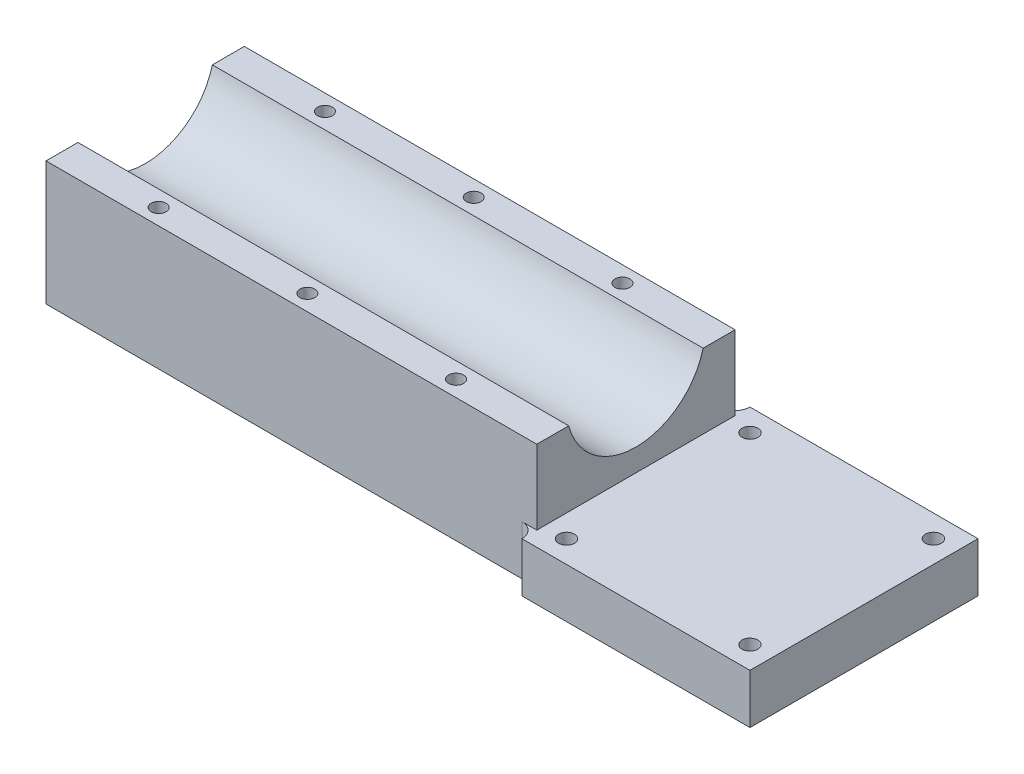
ISO-10303-21;
HEADER;
FILE_DESCRIPTION(('STEP AP214'),'2;1');
FILE_NAME('part.step','',(''),(''),'','','');
FILE_SCHEMA(('AUTOMOTIVE_DESIGN { 1 0 10303 214 1 1 1 1 }'));
ENDSEC;
DATA;
#1=APPLICATION_CONTEXT('core data for automotive mechanical design processes');
#2=APPLICATION_PROTOCOL_DEFINITION('international standard','automotive_design',2000,#1);
#3=PRODUCT_CONTEXT('',#1,'mechanical');
#4=PRODUCT('Part','Part','',(#3));
#5=PRODUCT_RELATED_PRODUCT_CATEGORY('part','',(#4));
#6=PRODUCT_DEFINITION_FORMATION('','',#4);
#7=PRODUCT_DEFINITION_CONTEXT('part definition',#1,'design');
#8=PRODUCT_DEFINITION('design','',#6,#7);
#9=PRODUCT_DEFINITION_SHAPE('','',#8);
#10=(LENGTH_UNIT() NAMED_UNIT(*) SI_UNIT(.MILLI.,.METRE.));
#11=(NAMED_UNIT(*) PLANE_ANGLE_UNIT() SI_UNIT($,.RADIAN.));
#12=(NAMED_UNIT(*) SI_UNIT($,.STERADIAN.) SOLID_ANGLE_UNIT());
#13=UNCERTAINTY_MEASURE_WITH_UNIT(LENGTH_MEASURE(1.E-05),#10,'distance_accuracy_value','');
#14=(GEOMETRIC_REPRESENTATION_CONTEXT(3) GLOBAL_UNCERTAINTY_ASSIGNED_CONTEXT((#13)) GLOBAL_UNIT_ASSIGNED_CONTEXT((#10,
#11,#12)) REPRESENTATION_CONTEXT('',''));
#15=CARTESIAN_POINT('',(0.,0.,0.));
#16=DIRECTION('',(0.,0.,1.));
#17=DIRECTION('',(1.,0.,0.));
#18=AXIS2_PLACEMENT_3D('',#15,#16,#17);
#19=CARTESIAN_POINT('',(103.5,-15.,-1.50000000000001));
#20=DIRECTION('',(0.,-1.,0.));
#21=DIRECTION('',(0.,0.,-1.));
#22=AXIS2_PLACEMENT_3D('',#19,#20,#21);
#23=CYLINDRICAL_SURFACE('',#22,1.60000000000001);
#24=CARTESIAN_POINT('',(103.5,-15.,-1.50000000000001));
#25=DIRECTION('',(0.,-1.,0.));
#26=DIRECTION('',(0.,0.,-1.));
#27=AXIS2_PLACEMENT_3D('',#24,#25,#26);
#28=CIRCLE('',#27,1.60000000000001);
#29=CARTESIAN_POINT('',(103.5,-15.,-3.10000000000002));
#30=VERTEX_POINT('',#29);
#31=EDGE_CURVE('E160',#30,#30,#28,.T.);
#32=ORIENTED_EDGE('',*,*,#31,.F.);
#33=EDGE_LOOP('',(#32));
#34=FACE_BOUND('',#33,.T.);
#35=CARTESIAN_POINT('',(103.5,-21.,-1.50000000000001));
#36=DIRECTION('',(0.,-1.,0.));
#37=DIRECTION('',(0.,0.,-1.));
#38=AXIS2_PLACEMENT_3D('',#35,#36,#37);
#39=CIRCLE('',#38,1.60000000000001);
#40=CARTESIAN_POINT('',(103.5,-21.,-3.10000000000002));
#41=VERTEX_POINT('',#40);
#42=EDGE_CURVE('E221',#41,#41,#39,.F.);
#43=ORIENTED_EDGE('',*,*,#42,.F.);
#44=EDGE_LOOP('',(#43));
#45=FACE_BOUND('',#44,.T.);
#46=ADVANCED_FACE('F35',(#34,#45),#23,.F.);
#47=CARTESIAN_POINT('',(140.5,-15.,-38.5));
#48=DIRECTION('',(0.,-1.,0.));
#49=DIRECTION('',(0.,0.,-1.));
#50=AXIS2_PLACEMENT_3D('',#47,#48,#49);
#51=CYLINDRICAL_SURFACE('',#50,1.60000000000002);
#52=CARTESIAN_POINT('',(140.5,-15.,-38.5));
#53=DIRECTION('',(0.,-1.,0.));
#54=DIRECTION('',(0.,0.,-1.));
#55=AXIS2_PLACEMENT_3D('',#52,#53,#54);
#56=CIRCLE('',#55,1.60000000000002);
#57=CARTESIAN_POINT('',(140.5,-15.,-40.1));
#58=VERTEX_POINT('',#57);
#59=EDGE_CURVE('E224',#58,#58,#56,.T.);
#60=ORIENTED_EDGE('',*,*,#59,.F.);
#61=EDGE_LOOP('',(#60));
#62=FACE_BOUND('',#61,.T.);
#63=CARTESIAN_POINT('',(140.5,-21.,-38.5));
#64=DIRECTION('',(0.,-1.,0.));
#65=DIRECTION('',(0.,0.,-1.));
#66=AXIS2_PLACEMENT_3D('',#63,#64,#65);
#67=CIRCLE('',#66,1.60000000000002);
#68=CARTESIAN_POINT('',(140.5,-21.,-40.1));
#69=VERTEX_POINT('',#68);
#70=EDGE_CURVE('E218',#69,#69,#67,.F.);
#71=ORIENTED_EDGE('',*,*,#70,.F.);
#72=EDGE_LOOP('',(#71));
#73=FACE_BOUND('',#72,.T.);
#74=ADVANCED_FACE('F280',(#62,#73),#51,.F.);
#75=CARTESIAN_POINT('',(103.5,-15.,-38.5));
#76=DIRECTION('',(0.,-1.,0.));
#77=DIRECTION('',(0.,0.,-1.));
#78=AXIS2_PLACEMENT_3D('',#75,#76,#77);
#79=CYLINDRICAL_SURFACE('',#78,1.60000000000001);
#80=CARTESIAN_POINT('',(103.5,-15.,-38.5));
#81=DIRECTION('',(0.,-1.,0.));
#82=DIRECTION('',(0.,0.,-1.));
#83=AXIS2_PLACEMENT_3D('',#80,#81,#82);
#84=CIRCLE('',#83,1.60000000000001);
#85=CARTESIAN_POINT('',(103.5,-15.,-40.1));
#86=VERTEX_POINT('',#85);
#87=EDGE_CURVE('E672',#86,#86,#84,.T.);
#88=ORIENTED_EDGE('',*,*,#87,.F.);
#89=EDGE_LOOP('',(#88));
#90=FACE_BOUND('',#89,.T.);
#91=CARTESIAN_POINT('',(103.5,-21.,-38.5));
#92=DIRECTION('',(0.,-1.,0.));
#93=DIRECTION('',(0.,0.,-1.));
#94=AXIS2_PLACEMENT_3D('',#91,#92,#93);
#95=CIRCLE('',#94,1.60000000000001);
#96=CARTESIAN_POINT('',(103.5,-21.,-40.1));
#97=VERTEX_POINT('',#96);
#98=EDGE_CURVE('E214',#97,#97,#95,.F.);
#99=ORIENTED_EDGE('',*,*,#98,.F.);
#100=EDGE_LOOP('',(#99));
#101=FACE_BOUND('',#100,.T.);
#102=ADVANCED_FACE('F286',(#90,#101),#79,.F.);
#103=CARTESIAN_POINT('',(140.5,-15.,-1.50000000000001));
#104=DIRECTION('',(0.,-1.,0.));
#105=DIRECTION('',(0.,0.,-1.));
#106=AXIS2_PLACEMENT_3D('',#103,#104,#105);
#107=CYLINDRICAL_SURFACE('',#106,1.60000000000002);
#108=CARTESIAN_POINT('',(140.5,-15.,-1.50000000000001));
#109=DIRECTION('',(0.,-1.,0.));
#110=DIRECTION('',(0.,0.,-1.));
#111=AXIS2_PLACEMENT_3D('',#108,#109,#110);
#112=CIRCLE('',#111,1.60000000000002);
#113=CARTESIAN_POINT('',(140.5,-15.,-3.10000000000003));
#114=VERTEX_POINT('',#113);
#115=EDGE_CURVE('E673',#114,#114,#112,.T.);
#116=ORIENTED_EDGE('',*,*,#115,.F.);
#117=EDGE_LOOP('',(#116));
#118=FACE_BOUND('',#117,.T.);
#119=CARTESIAN_POINT('',(140.5,-21.,-1.50000000000001));
#120=DIRECTION('',(0.,-1.,0.));
#121=DIRECTION('',(0.,0.,-1.));
#122=AXIS2_PLACEMENT_3D('',#119,#120,#121);
#123=CIRCLE('',#122,1.60000000000002);
#124=CARTESIAN_POINT('',(140.5,-21.,-3.10000000000003));
#125=VERTEX_POINT('',#124);
#126=EDGE_CURVE('E211',#125,#125,#123,.F.);
#127=ORIENTED_EDGE('',*,*,#126,.F.);
#128=EDGE_LOOP('',(#127));
#129=FACE_BOUND('',#128,.T.);
#130=ADVANCED_FACE('F543',(#118,#129),#107,.F.);
#131=CARTESIAN_POINT('',(99.,0.,0.));
#132=DIRECTION('',(1.,0.,0.));
#133=DIRECTION('',(0.,0.,-1.));
#134=AXIS2_PLACEMENT_3D('',#131,#132,#133);
#135=PLANE('',#134);
#136=DIRECTION('',(0.,-1.,0.));
#137=VECTOR('',#136,1.);
#138=CARTESIAN_POINT('',(99.,0.,0.));
#139=LINE('',#138,#137);
#140=CARTESIAN_POINT('',(99.,0.,0.));
#141=VERTEX_POINT('',#140);
#142=CARTESIAN_POINT('',(99.,-15.,0.));
#143=VERTEX_POINT('',#142);
#144=EDGE_CURVE('E181',#141,#143,#139,.T.);
#145=ORIENTED_EDGE('',*,*,#144,.T.);
#146=DIRECTION('',(0.,0.,-1.));
#147=VECTOR('',#146,1.);
#148=CARTESIAN_POINT('',(99.,-15.,3.));
#149=LINE('',#148,#147);
#150=CARTESIAN_POINT('',(99.,-15.,-40.));
#151=VERTEX_POINT('',#150);
#152=EDGE_CURVE('E154',#143,#151,#149,.T.);
#153=ORIENTED_EDGE('',*,*,#152,.T.);
#154=DIRECTION('',(0.,1.,0.));
#155=VECTOR('',#154,1.);
#156=CARTESIAN_POINT('',(99.,0.,-40.));
#157=LINE('',#156,#155);
#158=CARTESIAN_POINT('',(99.,0.,-40.));
#159=VERTEX_POINT('',#158);
#160=EDGE_CURVE('E184',#151,#159,#157,.T.);
#161=ORIENTED_EDGE('',*,*,#160,.T.);
#162=DIRECTION('',(0.,0.,1.));
#163=VECTOR('',#162,1.);
#164=CARTESIAN_POINT('',(99.,0.,0.));
#165=LINE('',#164,#163);
#166=CARTESIAN_POINT('',(99.,0.,-33.555441711726));
#167=VERTEX_POINT('',#166);
#168=EDGE_CURVE('E188',#159,#167,#165,.T.);
#169=ORIENTED_EDGE('',*,*,#168,.T.);
#170=CARTESIAN_POINT('',(99.,3.5,-20.));
#171=DIRECTION('',(-1.,0.,0.));
#172=DIRECTION('',(0.,0.,1.));
#173=AXIS2_PLACEMENT_3D('',#170,#171,#172);
#174=CIRCLE('',#173,14.);
#175=CARTESIAN_POINT('',(99.,0.,-6.44455828827404));
#176=VERTEX_POINT('',#175);
#177=EDGE_CURVE('E170',#167,#176,#174,.T.);
#178=ORIENTED_EDGE('',*,*,#177,.T.);
#179=EDGE_CURVE('E187',#176,#141,#165,.T.);
#180=ORIENTED_EDGE('',*,*,#179,.T.);
#181=EDGE_LOOP('',(#145,#153,#161,#169,#178,#180));
#182=FACE_BOUND('',#181,.T.);
#183=ADVANCED_FACE('F254',(#182),#135,.T.);
#184=CARTESIAN_POINT('',(99.,0.,0.));
#185=DIRECTION('',(0.,-1.,0.));
#186=DIRECTION('',(0.,0.,-1.));
#187=AXIS2_PLACEMENT_3D('',#184,#185,#186);
#188=PLANE('',#187);
#189=CARTESIAN_POINT('',(19.5,0.,-3.22227914413702));
#190=DIRECTION('',(0.,1.,0.));
#191=DIRECTION('',(0.,0.,1.));
#192=AXIS2_PLACEMENT_3D('',#189,#190,#191);
#193=CIRCLE('',#192,1.5);
#194=CARTESIAN_POINT('',(19.5,0.,-1.72227914413702));
#195=VERTEX_POINT('',#194);
#196=EDGE_CURVE('E722',#195,#195,#193,.T.);
#197=ORIENTED_EDGE('',*,*,#196,.F.);
#198=EDGE_LOOP('',(#197));
#199=FACE_BOUND('',#198,.T.);
#200=CARTESIAN_POINT('',(49.5,0.,-3.22227914413702));
#201=DIRECTION('',(0.,1.,0.));
#202=DIRECTION('',(0.,0.,1.));
#203=AXIS2_PLACEMENT_3D('',#200,#201,#202);
#204=CIRCLE('',#203,1.5);
#205=CARTESIAN_POINT('',(49.5,0.,-1.72227914413702));
#206=VERTEX_POINT('',#205);
#207=EDGE_CURVE('E644',#206,#206,#204,.T.);
#208=ORIENTED_EDGE('',*,*,#207,.F.);
#209=EDGE_LOOP('',(#208));
#210=FACE_BOUND('',#209,.T.);
#211=CARTESIAN_POINT('',(79.5,0.,-3.22227914413702));
#212=DIRECTION('',(0.,1.,0.));
#213=DIRECTION('',(0.,0.,1.));
#214=AXIS2_PLACEMENT_3D('',#211,#212,#213);
#215=CIRCLE('',#214,1.5);
#216=CARTESIAN_POINT('',(79.5,0.,-1.72227914413703));
#217=VERTEX_POINT('',#216);
#218=EDGE_CURVE('E727',#217,#217,#215,.T.);
#219=ORIENTED_EDGE('',*,*,#218,.F.);
#220=EDGE_LOOP('',(#219));
#221=FACE_BOUND('',#220,.T.);
#222=ORIENTED_EDGE('',*,*,#179,.F.);
#223=DIRECTION('',(-1.,0.,0.));
#224=VECTOR('',#223,1.);
#225=CARTESIAN_POINT('',(99.,0.,-6.44455828827404));
#226=LINE('',#225,#224);
#227=CARTESIAN_POINT('',(0.,0.,-6.44455828827404));
#228=VERTEX_POINT('',#227);
#229=EDGE_CURVE('E177',#176,#228,#226,.T.);
#230=ORIENTED_EDGE('',*,*,#229,.T.);
#231=DIRECTION('',(0.,0.,1.));
#232=VECTOR('',#231,1.);
#233=CARTESIAN_POINT('',(0.,0.,0.));
#234=LINE('',#233,#232);
#235=CARTESIAN_POINT('',(0.,0.,0.));
#236=VERTEX_POINT('',#235);
#237=EDGE_CURVE('E199',#228,#236,#234,.T.);
#238=ORIENTED_EDGE('',*,*,#237,.T.);
#239=DIRECTION('',(-1.,0.,0.));
#240=VECTOR('',#239,1.);
#241=CARTESIAN_POINT('',(99.,0.,0.));
#242=LINE('',#241,#240);
#243=EDGE_CURVE('E191',#141,#236,#242,.T.);
#244=ORIENTED_EDGE('',*,*,#243,.F.);
#245=EDGE_LOOP('',(#222,#230,#238,#244));
#246=FACE_BOUND('',#245,.T.);
#247=ADVANCED_FACE('F267',(#199,#210,#221,#246),#188,.F.);
#248=CARTESIAN_POINT('',(99.,0.,0.));
#249=DIRECTION('',(0.,0.,-1.));
#250=DIRECTION('',(0.,1.,0.));
#251=AXIS2_PLACEMENT_3D('',#248,#249,#250);
#252=PLANE('',#251);
#253=DIRECTION('',(-1.,0.,0.));
#254=VECTOR('',#253,1.);
#255=CARTESIAN_POINT('',(99.,-25.,0.));
#256=LINE('',#255,#254);
#257=CARTESIAN_POINT('',(96.,-25.,0.));
#258=VERTEX_POINT('',#257);
#259=CARTESIAN_POINT('',(0.,-25.,0.));
#260=VERTEX_POINT('',#259);
#261=EDGE_CURVE('E209',#258,#260,#256,.T.);
#262=ORIENTED_EDGE('',*,*,#261,.F.);
#263=DIRECTION('',(0.,-1.,0.));
#264=VECTOR('',#263,1.);
#265=CARTESIAN_POINT('',(96.,0.,0.));
#266=LINE('',#265,#264);
#267=CARTESIAN_POINT('',(96.,-15.,0.));
#268=VERTEX_POINT('',#267);
#269=EDGE_CURVE('E130',#258,#268,#266,.F.);
#270=ORIENTED_EDGE('',*,*,#269,.T.);
#271=DIRECTION('',(1.,0.,0.));
#272=VECTOR('',#271,1.);
#273=CARTESIAN_POINT('',(0.,-15.,0.));
#274=LINE('',#273,#272);
#275=EDGE_CURVE('E55',#268,#143,#274,.T.);
#276=ORIENTED_EDGE('',*,*,#275,.T.);
#277=ORIENTED_EDGE('',*,*,#144,.F.);
#278=ORIENTED_EDGE('',*,*,#243,.T.);
#279=DIRECTION('',(0.,-1.,0.));
#280=VECTOR('',#279,1.);
#281=CARTESIAN_POINT('',(0.,0.,0.));
#282=LINE('',#281,#280);
#283=EDGE_CURVE('E180',#236,#260,#282,.T.);
#284=ORIENTED_EDGE('',*,*,#283,.T.);
#285=EDGE_LOOP('',(#262,#270,#276,#277,#278,#284));
#286=FACE_BOUND('',#285,.T.);
#287=ADVANCED_FACE('F238',(#286),#252,.F.);
#288=CARTESIAN_POINT('',(99.,-25.,0.));
#289=DIRECTION('',(0.,1.,0.));
#290=DIRECTION('',(0.,0.,1.));
#291=AXIS2_PLACEMENT_3D('',#288,#289,#290);
#292=PLANE('',#291);
#293=CARTESIAN_POINT('',(140.5,-25.,-1.50000000000001));
#294=DIRECTION('',(0.,-1.,0.));
#295=DIRECTION('',(0.,0.,-1.));
#296=AXIS2_PLACEMENT_3D('',#293,#294,#295);
#297=CIRCLE('',#296,2.99999999999999);
#298=CARTESIAN_POINT('',(140.5,-25.,-4.50000000000001));
#299=VERTEX_POINT('',#298);
#300=EDGE_CURVE('E641',#299,#299,#297,.T.);
#301=ORIENTED_EDGE('',*,*,#300,.F.);
#302=EDGE_LOOP('',(#301));
#303=FACE_BOUND('',#302,.T.);
#304=CARTESIAN_POINT('',(140.5,-25.,-38.5));
#305=DIRECTION('',(0.,-1.,0.));
#306=DIRECTION('',(0.,0.,-1.));
#307=AXIS2_PLACEMENT_3D('',#304,#305,#306);
#308=CIRCLE('',#307,2.99999999999999);
#309=CARTESIAN_POINT('',(140.5,-25.,-41.5));
#310=VERTEX_POINT('',#309);
#311=EDGE_CURVE('E658',#310,#310,#308,.T.);
#312=ORIENTED_EDGE('',*,*,#311,.F.);
#313=EDGE_LOOP('',(#312));
#314=FACE_BOUND('',#313,.T.);
#315=CARTESIAN_POINT('',(103.5,-25.,-38.5));
#316=DIRECTION('',(0.,-1.,0.));
#317=DIRECTION('',(0.,0.,-1.));
#318=AXIS2_PLACEMENT_3D('',#315,#316,#317);
#319=CIRCLE('',#318,3.00000000000001);
#320=CARTESIAN_POINT('',(103.5,-25.,-41.5));
#321=VERTEX_POINT('',#320);
#322=EDGE_CURVE('E652',#321,#321,#319,.T.);
#323=ORIENTED_EDGE('',*,*,#322,.F.);
#324=EDGE_LOOP('',(#323));
#325=FACE_BOUND('',#324,.T.);
#326=CARTESIAN_POINT('',(103.5,-25.,-1.50000000000001));
#327=DIRECTION('',(0.,-1.,0.));
#328=DIRECTION('',(0.,0.,-1.));
#329=AXIS2_PLACEMENT_3D('',#326,#327,#328);
#330=CIRCLE('',#329,3.00000000000001);
#331=CARTESIAN_POINT('',(103.5,-25.,-4.50000000000002));
#332=VERTEX_POINT('',#331);
#333=EDGE_CURVE('E651',#332,#332,#330,.T.);
#334=ORIENTED_EDGE('',*,*,#333,.F.);
#335=EDGE_LOOP('',(#334));
#336=FACE_BOUND('',#335,.T.);
#337=DIRECTION('',(0.,0.,-1.));
#338=VECTOR('',#337,1.);
#339=CARTESIAN_POINT('',(0.,-25.,0.));
#340=LINE('',#339,#338);
#341=CARTESIAN_POINT('',(0.,-25.,-40.));
#342=VERTEX_POINT('',#341);
#343=EDGE_CURVE('E194',#260,#342,#340,.T.);
#344=ORIENTED_EDGE('',*,*,#343,.T.);
#345=DIRECTION('',(-1.,0.,0.));
#346=VECTOR('',#345,1.);
#347=CARTESIAN_POINT('',(99.,-25.,-40.));
#348=LINE('',#347,#346);
#349=CARTESIAN_POINT('',(96.,-25.,-40.));
#350=VERTEX_POINT('',#349);
#351=EDGE_CURVE('E207',#350,#342,#348,.T.);
#352=ORIENTED_EDGE('',*,*,#351,.F.);
#353=CARTESIAN_POINT('',(96.,-25.,-43.));
#354=DIRECTION('',(0.,1.,0.));
#355=DIRECTION('',(0.,0.,1.));
#356=AXIS2_PLACEMENT_3D('',#353,#354,#355);
#357=CIRCLE('',#356,3.);
#358=CARTESIAN_POINT('',(99.,-25.,-43.));
#359=VERTEX_POINT('',#358);
#360=EDGE_CURVE('E129',#350,#359,#357,.T.);
#361=ORIENTED_EDGE('',*,*,#360,.T.);
#362=DIRECTION('',(1.,0.,0.));
#363=VECTOR('',#362,1.);
#364=CARTESIAN_POINT('',(99.,-25.,-43.));
#365=LINE('',#364,#363);
#366=CARTESIAN_POINT('',(145.,-25.,-43.));
#367=VERTEX_POINT('',#366);
#368=EDGE_CURVE('E138',#359,#367,#365,.T.);
#369=ORIENTED_EDGE('',*,*,#368,.T.);
#370=DIRECTION('',(0.,0.,1.));
#371=VECTOR('',#370,1.);
#372=CARTESIAN_POINT('',(145.,-25.,3.00000000000001));
#373=LINE('',#372,#371);
#374=CARTESIAN_POINT('',(145.,-25.,3.00000000000001));
#375=VERTEX_POINT('',#374);
#376=EDGE_CURVE('E151',#367,#375,#373,.T.);
#377=ORIENTED_EDGE('',*,*,#376,.T.);
#378=DIRECTION('',(-1.,0.,0.));
#379=VECTOR('',#378,1.);
#380=CARTESIAN_POINT('',(99.,-25.,3.));
#381=LINE('',#380,#379);
#382=CARTESIAN_POINT('',(99.,-25.,3.));
#383=VERTEX_POINT('',#382);
#384=EDGE_CURVE('E147',#375,#383,#381,.T.);
#385=ORIENTED_EDGE('',*,*,#384,.T.);
#386=CARTESIAN_POINT('',(96.,-25.,3.));
#387=DIRECTION('',(0.,1.,0.));
#388=DIRECTION('',(0.,0.,1.));
#389=AXIS2_PLACEMENT_3D('',#386,#387,#388);
#390=CIRCLE('',#389,3.);
#391=EDGE_CURVE('E43',#383,#258,#390,.T.);
#392=ORIENTED_EDGE('',*,*,#391,.T.);
#393=ORIENTED_EDGE('',*,*,#261,.T.);
#394=EDGE_LOOP('',(#344,#352,#361,#369,#377,#385,#392,#393));
#395=FACE_BOUND('',#394,.T.);
#396=ADVANCED_FACE('F231',(#303,#314,#325,#336,#395),#292,.F.);
#397=CARTESIAN_POINT('',(99.,0.,-40.));
#398=DIRECTION('',(0.,0.,1.));
#399=DIRECTION('',(1.,0.,0.));
#400=AXIS2_PLACEMENT_3D('',#397,#398,#399);
#401=PLANE('',#400);
#402=ORIENTED_EDGE('',*,*,#160,.F.);
#403=DIRECTION('',(-1.,0.,0.));
#404=VECTOR('',#403,1.);
#405=CARTESIAN_POINT('',(0.,-15.,-40.));
#406=LINE('',#405,#404);
#407=CARTESIAN_POINT('',(96.,-15.,-40.));
#408=VERTEX_POINT('',#407);
#409=EDGE_CURVE('E50',#151,#408,#406,.T.);
#410=ORIENTED_EDGE('',*,*,#409,.T.);
#411=DIRECTION('',(0.,1.,0.));
#412=VECTOR('',#411,1.);
#413=CARTESIAN_POINT('',(96.,0.,-40.));
#414=LINE('',#413,#412);
#415=EDGE_CURVE('E127',#408,#350,#414,.F.);
#416=ORIENTED_EDGE('',*,*,#415,.T.);
#417=ORIENTED_EDGE('',*,*,#351,.T.);
#418=DIRECTION('',(0.,1.,0.));
#419=VECTOR('',#418,1.);
#420=CARTESIAN_POINT('',(0.,0.,-40.));
#421=LINE('',#420,#419);
#422=CARTESIAN_POINT('',(0.,0.,-40.));
#423=VERTEX_POINT('',#422);
#424=EDGE_CURVE('E197',#342,#423,#421,.T.);
#425=ORIENTED_EDGE('',*,*,#424,.T.);
#426=DIRECTION('',(-1.,0.,0.));
#427=VECTOR('',#426,1.);
#428=CARTESIAN_POINT('',(99.,0.,-40.));
#429=LINE('',#428,#427);
#430=EDGE_CURVE('E204',#159,#423,#429,.T.);
#431=ORIENTED_EDGE('',*,*,#430,.F.);
#432=EDGE_LOOP('',(#402,#410,#416,#417,#425,#431));
#433=FACE_BOUND('',#432,.T.);
#434=ADVANCED_FACE('F249',(#433),#401,.F.);
#435=CARTESIAN_POINT('',(79.5,0.,-36.777720855863));
#436=DIRECTION('',(0.,1.,0.));
#437=DIRECTION('',(0.,0.,1.));
#438=AXIS2_PLACEMENT_3D('',#435,#436,#437);
#439=CIRCLE('',#438,1.5);
#440=CARTESIAN_POINT('',(79.5,0.,-35.277720855863));
#441=VERTEX_POINT('',#440);
#442=EDGE_CURVE('E628',#441,#441,#439,.T.);
#443=ORIENTED_EDGE('',*,*,#442,.F.);
#444=EDGE_LOOP('',(#443));
#445=FACE_BOUND('',#444,.T.);
#446=CARTESIAN_POINT('',(19.5,0.,-36.777720855863));
#447=DIRECTION('',(0.,1.,0.));
#448=DIRECTION('',(0.,0.,1.));
#449=AXIS2_PLACEMENT_3D('',#446,#447,#448);
#450=CIRCLE('',#449,1.5);
#451=CARTESIAN_POINT('',(19.5,0.,-35.277720855863));
#452=VERTEX_POINT('',#451);
#453=EDGE_CURVE('E632',#452,#452,#450,.T.);
#454=ORIENTED_EDGE('',*,*,#453,.F.);
#455=EDGE_LOOP('',(#454));
#456=FACE_BOUND('',#455,.T.);
#457=CARTESIAN_POINT('',(49.5,0.,-36.777720855863));
#458=DIRECTION('',(0.,1.,0.));
#459=DIRECTION('',(0.,0.,1.));
#460=AXIS2_PLACEMENT_3D('',#457,#458,#459);
#461=CIRCLE('',#460,1.5);
#462=CARTESIAN_POINT('',(49.5,0.,-35.277720855863));
#463=VERTEX_POINT('',#462);
#464=EDGE_CURVE('E635',#463,#463,#461,.T.);
#465=ORIENTED_EDGE('',*,*,#464,.F.);
#466=EDGE_LOOP('',(#465));
#467=FACE_BOUND('',#466,.T.);
#468=CARTESIAN_POINT('',(0.,0.,-33.555441711726));
#469=VERTEX_POINT('',#468);
#470=EDGE_CURVE('E185',#423,#469,#234,.T.);
#471=ORIENTED_EDGE('',*,*,#470,.T.);
#472=DIRECTION('',(-1.,0.,0.));
#473=VECTOR('',#472,1.);
#474=CARTESIAN_POINT('',(99.,0.,-33.555441711726));
#475=LINE('',#474,#473);
#476=EDGE_CURVE('E173',#469,#167,#475,.F.);
#477=ORIENTED_EDGE('',*,*,#476,.T.);
#478=ORIENTED_EDGE('',*,*,#168,.F.);
#479=ORIENTED_EDGE('',*,*,#430,.T.);
#480=EDGE_LOOP('',(#471,#477,#478,#479));
#481=FACE_BOUND('',#480,.T.);
#482=ADVANCED_FACE('F265',(#445,#456,#467,#481),#188,.F.);
#483=CARTESIAN_POINT('',(0.,0.,0.));
#484=DIRECTION('',(1.,0.,0.));
#485=DIRECTION('',(0.,0.,-1.));
#486=AXIS2_PLACEMENT_3D('',#483,#484,#485);
#487=PLANE('',#486);
#488=ORIENTED_EDGE('',*,*,#237,.F.);
#489=CARTESIAN_POINT('',(0.,3.5,-20.));
#490=DIRECTION('',(-1.,0.,0.));
#491=DIRECTION('',(0.,0.,1.));
#492=AXIS2_PLACEMENT_3D('',#489,#490,#491);
#493=CIRCLE('',#492,14.);
#494=EDGE_CURVE('E166',#469,#228,#493,.T.);
#495=ORIENTED_EDGE('',*,*,#494,.F.);
#496=ORIENTED_EDGE('',*,*,#470,.F.);
#497=ORIENTED_EDGE('',*,*,#424,.F.);
#498=ORIENTED_EDGE('',*,*,#343,.F.);
#499=ORIENTED_EDGE('',*,*,#283,.F.);
#500=EDGE_LOOP('',(#488,#495,#496,#497,#498,#499));
#501=FACE_BOUND('',#500,.T.);
#502=ADVANCED_FACE('F261',(#501),#487,.F.);
#503=CARTESIAN_POINT('',(99.,3.5,-20.));
#504=DIRECTION('',(-1.,0.,0.));
#505=DIRECTION('',(0.,0.,1.));
#506=AXIS2_PLACEMENT_3D('',#503,#504,#505);
#507=CYLINDRICAL_SURFACE('',#506,14.);
#508=ORIENTED_EDGE('',*,*,#177,.F.);
#509=ORIENTED_EDGE('',*,*,#476,.F.);
#510=ORIENTED_EDGE('',*,*,#494,.T.);
#511=ORIENTED_EDGE('',*,*,#229,.F.);
#512=EDGE_LOOP('',(#508,#509,#510,#511));
#513=FACE_BOUND('',#512,.T.);
#514=ADVANCED_FACE('F268',(#513),#507,.F.);
#515=CARTESIAN_POINT('',(99.,-15.,3.));
#516=DIRECTION('',(0.,0.,1.));
#517=DIRECTION('',(1.,0.,0.));
#518=AXIS2_PLACEMENT_3D('',#515,#516,#517);
#519=PLANE('',#518);
#520=ORIENTED_EDGE('',*,*,#384,.F.);
#521=DIRECTION('',(0.,-1.,0.));
#522=VECTOR('',#521,1.);
#523=CARTESIAN_POINT('',(145.,-15.,3.00000000000001));
#524=LINE('',#523,#522);
#525=CARTESIAN_POINT('',(145.,-15.,3.00000000000001));
#526=VERTEX_POINT('',#525);
#527=EDGE_CURVE('E167',#526,#375,#524,.T.);
#528=ORIENTED_EDGE('',*,*,#527,.F.);
#529=DIRECTION('',(-1.,0.,0.));
#530=VECTOR('',#529,1.);
#531=CARTESIAN_POINT('',(99.,-15.,3.));
#532=LINE('',#531,#530);
#533=CARTESIAN_POINT('',(99.,-15.,3.));
#534=VERTEX_POINT('',#533);
#535=EDGE_CURVE('E140',#526,#534,#532,.T.);
#536=ORIENTED_EDGE('',*,*,#535,.T.);
#537=DIRECTION('',(0.,-1.,0.));
#538=VECTOR('',#537,1.);
#539=CARTESIAN_POINT('',(99.,-15.,3.));
#540=LINE('',#539,#538);
#541=EDGE_CURVE('E163',#534,#383,#540,.T.);
#542=ORIENTED_EDGE('',*,*,#541,.T.);
#543=EDGE_LOOP('',(#520,#528,#536,#542));
#544=FACE_BOUND('',#543,.T.);
#545=ADVANCED_FACE('F242',(#544),#519,.T.);
#546=CARTESIAN_POINT('',(145.,-15.,3.00000000000001));
#547=DIRECTION('',(1.,0.,0.));
#548=DIRECTION('',(0.,0.,-1.));
#549=AXIS2_PLACEMENT_3D('',#546,#547,#548);
#550=PLANE('',#549);
#551=ORIENTED_EDGE('',*,*,#376,.F.);
#552=DIRECTION('',(0.,-1.,0.));
#553=VECTOR('',#552,1.);
#554=CARTESIAN_POINT('',(145.,-15.,-43.));
#555=LINE('',#554,#553);
#556=CARTESIAN_POINT('',(145.,-15.,-43.));
#557=VERTEX_POINT('',#556);
#558=EDGE_CURVE('E139',#557,#367,#555,.T.);
#559=ORIENTED_EDGE('',*,*,#558,.F.);
#560=DIRECTION('',(0.,0.,1.));
#561=VECTOR('',#560,1.);
#562=CARTESIAN_POINT('',(145.,-15.,3.00000000000001));
#563=LINE('',#562,#561);
#564=EDGE_CURVE('E146',#557,#526,#563,.T.);
#565=ORIENTED_EDGE('',*,*,#564,.T.);
#566=ORIENTED_EDGE('',*,*,#527,.T.);
#567=EDGE_LOOP('',(#551,#559,#565,#566));
#568=FACE_BOUND('',#567,.T.);
#569=ADVANCED_FACE('F245',(#568),#550,.T.);
#570=CARTESIAN_POINT('',(99.,-15.,-43.));
#571=DIRECTION('',(0.,0.,-1.));
#572=DIRECTION('',(-1.,0.,0.));
#573=AXIS2_PLACEMENT_3D('',#570,#571,#572);
#574=PLANE('',#573);
#575=ORIENTED_EDGE('',*,*,#368,.F.);
#576=DIRECTION('',(0.,-1.,0.));
#577=VECTOR('',#576,1.);
#578=CARTESIAN_POINT('',(99.,-15.,-43.));
#579=LINE('',#578,#577);
#580=CARTESIAN_POINT('',(99.,-15.,-43.));
#581=VERTEX_POINT('',#580);
#582=EDGE_CURVE('E126',#581,#359,#579,.T.);
#583=ORIENTED_EDGE('',*,*,#582,.F.);
#584=DIRECTION('',(1.,0.,0.));
#585=VECTOR('',#584,1.);
#586=CARTESIAN_POINT('',(99.,-15.,-43.));
#587=LINE('',#586,#585);
#588=EDGE_CURVE('E136',#581,#557,#587,.T.);
#589=ORIENTED_EDGE('',*,*,#588,.T.);
#590=ORIENTED_EDGE('',*,*,#558,.T.);
#591=EDGE_LOOP('',(#575,#583,#589,#590));
#592=FACE_BOUND('',#591,.T.);
#593=ADVANCED_FACE('F135',(#592),#574,.T.);
#594=CARTESIAN_POINT('',(0.,-15.,0.));
#595=DIRECTION('',(0.,-1.,0.));
#596=DIRECTION('',(0.,0.,-1.));
#597=AXIS2_PLACEMENT_3D('',#594,#595,#596);
#598=PLANE('',#597);
#599=ORIENTED_EDGE('',*,*,#115,.T.);
#600=EDGE_LOOP('',(#599));
#601=FACE_BOUND('',#600,.T.);
#602=ORIENTED_EDGE('',*,*,#87,.T.);
#603=EDGE_LOOP('',(#602));
#604=FACE_BOUND('',#603,.T.);
#605=ORIENTED_EDGE('',*,*,#59,.T.);
#606=EDGE_LOOP('',(#605));
#607=FACE_BOUND('',#606,.T.);
#608=ORIENTED_EDGE('',*,*,#31,.T.);
#609=EDGE_LOOP('',(#608));
#610=FACE_BOUND('',#609,.T.);
#611=ORIENTED_EDGE('',*,*,#152,.F.);
#612=ORIENTED_EDGE('',*,*,#275,.F.);
#613=CARTESIAN_POINT('',(96.,-15.,3.));
#614=DIRECTION('',(0.,-1.,0.));
#615=DIRECTION('',(0.,0.,-1.));
#616=AXIS2_PLACEMENT_3D('',#613,#614,#615);
#617=CIRCLE('',#616,3.);
#618=EDGE_CURVE('E11',#268,#534,#617,.T.);
#619=ORIENTED_EDGE('',*,*,#618,.T.);
#620=ORIENTED_EDGE('',*,*,#535,.F.);
#621=ORIENTED_EDGE('',*,*,#564,.F.);
#622=ORIENTED_EDGE('',*,*,#588,.F.);
#623=CARTESIAN_POINT('',(96.,-15.,-43.));
#624=DIRECTION('',(0.,-1.,0.));
#625=DIRECTION('',(0.,0.,-1.));
#626=AXIS2_PLACEMENT_3D('',#623,#624,#625);
#627=CIRCLE('',#626,3.);
#628=EDGE_CURVE('E122',#581,#408,#627,.T.);
#629=ORIENTED_EDGE('',*,*,#628,.T.);
#630=ORIENTED_EDGE('',*,*,#409,.F.);
#631=EDGE_LOOP('',(#611,#612,#619,#620,#621,#622,#629,#630));
#632=FACE_BOUND('',#631,.T.);
#633=ADVANCED_FACE('F143',(#601,#604,#607,#610,#632),#598,.F.);
#634=CARTESIAN_POINT('',(140.5,-21.,-1.50000000000001));
#635=DIRECTION('',(0.,-1.,0.));
#636=DIRECTION('',(0.,0.,-1.));
#637=AXIS2_PLACEMENT_3D('',#634,#635,#636);
#638=PLANE('',#637);
#639=CARTESIAN_POINT('',(140.5,-21.,-1.50000000000001));
#640=DIRECTION('',(0.,-1.,0.));
#641=DIRECTION('',(0.,0.,-1.));
#642=AXIS2_PLACEMENT_3D('',#639,#640,#641);
#643=CIRCLE('',#642,2.99999999999999);
#644=CARTESIAN_POINT('',(140.5,-21.,-4.50000000000001));
#645=VERTEX_POINT('',#644);
#646=EDGE_CURVE('E661',#645,#645,#643,.T.);
#647=ORIENTED_EDGE('',*,*,#646,.T.);
#648=EDGE_LOOP('',(#647));
#649=FACE_BOUND('',#648,.T.);
#650=ORIENTED_EDGE('',*,*,#126,.T.);
#651=EDGE_LOOP('',(#650));
#652=FACE_BOUND('',#651,.T.);
#653=ADVANCED_FACE('F295',(#649,#652),#638,.T.);
#654=CARTESIAN_POINT('',(140.5,-21.,-1.50000000000001));
#655=DIRECTION('',(0.,-1.,0.));
#656=DIRECTION('',(0.,0.,-1.));
#657=AXIS2_PLACEMENT_3D('',#654,#655,#656);
#658=CYLINDRICAL_SURFACE('',#657,2.99999999999999);
#659=ORIENTED_EDGE('',*,*,#646,.F.);
#660=EDGE_LOOP('',(#659));
#661=FACE_BOUND('',#660,.T.);
#662=ORIENTED_EDGE('',*,*,#300,.T.);
#663=EDGE_LOOP('',(#662));
#664=FACE_BOUND('',#663,.T.);
#665=ADVANCED_FACE('F316',(#661,#664),#658,.F.);
#666=CARTESIAN_POINT('',(103.5,-21.,-38.5));
#667=DIRECTION('',(0.,-1.,0.));
#668=DIRECTION('',(0.,0.,-1.));
#669=AXIS2_PLACEMENT_3D('',#666,#667,#668);
#670=PLANE('',#669);
#671=CARTESIAN_POINT('',(103.5,-21.,-38.5));
#672=DIRECTION('',(0.,-1.,0.));
#673=DIRECTION('',(0.,0.,-1.));
#674=AXIS2_PLACEMENT_3D('',#671,#672,#673);
#675=CIRCLE('',#674,3.00000000000001);
#676=CARTESIAN_POINT('',(103.5,-21.,-41.5));
#677=VERTEX_POINT('',#676);
#678=EDGE_CURVE('E648',#677,#677,#675,.T.);
#679=ORIENTED_EDGE('',*,*,#678,.T.);
#680=EDGE_LOOP('',(#679));
#681=FACE_BOUND('',#680,.T.);
#682=ORIENTED_EDGE('',*,*,#98,.T.);
#683=EDGE_LOOP('',(#682));
#684=FACE_BOUND('',#683,.T.);
#685=ADVANCED_FACE('F325',(#681,#684),#670,.T.);
#686=CARTESIAN_POINT('',(103.5,-21.,-38.5));
#687=DIRECTION('',(0.,-1.,0.));
#688=DIRECTION('',(0.,0.,-1.));
#689=AXIS2_PLACEMENT_3D('',#686,#687,#688);
#690=CYLINDRICAL_SURFACE('',#689,3.00000000000001);
#691=ORIENTED_EDGE('',*,*,#678,.F.);
#692=EDGE_LOOP('',(#691));
#693=FACE_BOUND('',#692,.T.);
#694=ORIENTED_EDGE('',*,*,#322,.T.);
#695=EDGE_LOOP('',(#694));
#696=FACE_BOUND('',#695,.T.);
#697=ADVANCED_FACE('F333',(#693,#696),#690,.F.);
#698=CARTESIAN_POINT('',(140.5,-21.,-38.5));
#699=DIRECTION('',(0.,-1.,0.));
#700=DIRECTION('',(0.,0.,-1.));
#701=AXIS2_PLACEMENT_3D('',#698,#699,#700);
#702=PLANE('',#701);
#703=CARTESIAN_POINT('',(140.5,-21.,-38.5));
#704=DIRECTION('',(0.,-1.,0.));
#705=DIRECTION('',(0.,0.,-1.));
#706=AXIS2_PLACEMENT_3D('',#703,#704,#705);
#707=CIRCLE('',#706,2.99999999999999);
#708=CARTESIAN_POINT('',(140.5,-21.,-41.5));
#709=VERTEX_POINT('',#708);
#710=EDGE_CURVE('E655',#709,#709,#707,.T.);
#711=ORIENTED_EDGE('',*,*,#710,.T.);
#712=EDGE_LOOP('',(#711));
#713=FACE_BOUND('',#712,.T.);
#714=ORIENTED_EDGE('',*,*,#70,.T.);
#715=EDGE_LOOP('',(#714));
#716=FACE_BOUND('',#715,.T.);
#717=ADVANCED_FACE('F341',(#713,#716),#702,.T.);
#718=CARTESIAN_POINT('',(140.5,-21.,-38.5));
#719=DIRECTION('',(0.,-1.,0.));
#720=DIRECTION('',(0.,0.,-1.));
#721=AXIS2_PLACEMENT_3D('',#718,#719,#720);
#722=CYLINDRICAL_SURFACE('',#721,2.99999999999999);
#723=ORIENTED_EDGE('',*,*,#710,.F.);
#724=EDGE_LOOP('',(#723));
#725=FACE_BOUND('',#724,.T.);
#726=ORIENTED_EDGE('',*,*,#311,.T.);
#727=EDGE_LOOP('',(#726));
#728=FACE_BOUND('',#727,.T.);
#729=ADVANCED_FACE('F349',(#725,#728),#722,.F.);
#730=CARTESIAN_POINT('',(103.5,-21.,-1.50000000000001));
#731=DIRECTION('',(0.,-1.,0.));
#732=DIRECTION('',(0.,0.,-1.));
#733=AXIS2_PLACEMENT_3D('',#730,#731,#732);
#734=PLANE('',#733);
#735=CARTESIAN_POINT('',(103.5,-21.,-1.50000000000001));
#736=DIRECTION('',(0.,-1.,0.));
#737=DIRECTION('',(0.,0.,-1.));
#738=AXIS2_PLACEMENT_3D('',#735,#736,#737);
#739=CIRCLE('',#738,3.00000000000001);
#740=CARTESIAN_POINT('',(103.5,-21.,-4.50000000000002));
#741=VERTEX_POINT('',#740);
#742=EDGE_CURVE('E215',#741,#741,#739,.T.);
#743=ORIENTED_EDGE('',*,*,#742,.T.);
#744=EDGE_LOOP('',(#743));
#745=FACE_BOUND('',#744,.T.);
#746=ORIENTED_EDGE('',*,*,#42,.T.);
#747=EDGE_LOOP('',(#746));
#748=FACE_BOUND('',#747,.T.);
#749=ADVANCED_FACE('F357',(#745,#748),#734,.T.);
#750=CARTESIAN_POINT('',(103.5,-21.,-1.50000000000001));
#751=DIRECTION('',(0.,-1.,0.));
#752=DIRECTION('',(0.,0.,-1.));
#753=AXIS2_PLACEMENT_3D('',#750,#751,#752);
#754=CYLINDRICAL_SURFACE('',#753,3.00000000000001);
#755=ORIENTED_EDGE('',*,*,#742,.F.);
#756=EDGE_LOOP('',(#755));
#757=FACE_BOUND('',#756,.T.);
#758=ORIENTED_EDGE('',*,*,#333,.T.);
#759=EDGE_LOOP('',(#758));
#760=FACE_BOUND('',#759,.T.);
#761=ADVANCED_FACE('F365',(#757,#760),#754,.F.);
#762=CARTESIAN_POINT('',(96.,-15.,-43.));
#763=DIRECTION('',(0.,1.,0.));
#764=DIRECTION('',(0.,0.,1.));
#765=AXIS2_PLACEMENT_3D('',#762,#763,#764);
#766=CYLINDRICAL_SURFACE('',#765,3.);
#767=ORIENTED_EDGE('',*,*,#360,.F.);
#768=ORIENTED_EDGE('',*,*,#415,.F.);
#769=ORIENTED_EDGE('',*,*,#628,.F.);
#770=ORIENTED_EDGE('',*,*,#582,.T.);
#771=EDGE_LOOP('',(#767,#768,#769,#770));
#772=FACE_BOUND('',#771,.T.);
#773=ADVANCED_FACE('F125',(#772),#766,.F.);
#774=CARTESIAN_POINT('',(96.,-15.,3.));
#775=DIRECTION('',(0.,-1.,0.));
#776=DIRECTION('',(0.,0.,-1.));
#777=AXIS2_PLACEMENT_3D('',#774,#775,#776);
#778=CYLINDRICAL_SURFACE('',#777,3.);
#779=ORIENTED_EDGE('',*,*,#618,.F.);
#780=ORIENTED_EDGE('',*,*,#269,.F.);
#781=ORIENTED_EDGE('',*,*,#391,.F.);
#782=ORIENTED_EDGE('',*,*,#541,.F.);
#783=EDGE_LOOP('',(#779,#780,#781,#782));
#784=FACE_BOUND('',#783,.T.);
#785=ADVANCED_FACE('F37',(#784),#778,.F.);
#786=CARTESIAN_POINT('',(49.5,-10.,-36.777720855863));
#787=DIRECTION('',(0.,1.,0.));
#788=DIRECTION('',(0.,0.,1.));
#789=AXIS2_PLACEMENT_3D('',#786,#787,#788);
#790=CYLINDRICAL_SURFACE('',#789,1.5);
#791=CARTESIAN_POINT('',(49.5,-10.,-36.777720855863));
#792=DIRECTION('',(0.,1.,0.));
#793=DIRECTION('',(0.,0.,1.));
#794=AXIS2_PLACEMENT_3D('',#791,#792,#793);
#795=CIRCLE('',#794,1.5);
#796=CARTESIAN_POINT('',(49.5,-10.,-35.277720855863));
#797=VERTEX_POINT('',#796);
#798=EDGE_CURVE('E637',#797,#797,#795,.T.);
#799=ORIENTED_EDGE('',*,*,#798,.F.);
#800=EDGE_LOOP('',(#799));
#801=FACE_BOUND('',#800,.T.);
#802=ORIENTED_EDGE('',*,*,#464,.T.);
#803=EDGE_LOOP('',(#802));
#804=FACE_BOUND('',#803,.T.);
#805=ADVANCED_FACE('F385',(#801,#804),#790,.F.);
#806=CARTESIAN_POINT('',(49.5,-10.,-36.777720855863));
#807=DIRECTION('',(0.,1.,0.));
#808=DIRECTION('',(0.,0.,1.));
#809=AXIS2_PLACEMENT_3D('',#806,#807,#808);
#810=PLANE('',#809);
#811=ORIENTED_EDGE('',*,*,#798,.T.);
#812=EDGE_LOOP('',(#811));
#813=FACE_BOUND('',#812,.T.);
#814=ADVANCED_FACE('F392',(#813),#810,.T.);
#815=CARTESIAN_POINT('',(19.5,-10.,-36.777720855863));
#816=DIRECTION('',(0.,1.,0.));
#817=DIRECTION('',(0.,0.,1.));
#818=AXIS2_PLACEMENT_3D('',#815,#816,#817);
#819=CYLINDRICAL_SURFACE('',#818,1.5);
#820=CARTESIAN_POINT('',(19.5,-10.,-36.777720855863));
#821=DIRECTION('',(0.,1.,0.));
#822=DIRECTION('',(0.,0.,1.));
#823=AXIS2_PLACEMENT_3D('',#820,#821,#822);
#824=CIRCLE('',#823,1.5);
#825=CARTESIAN_POINT('',(19.5,-10.,-35.277720855863));
#826=VERTEX_POINT('',#825);
#827=EDGE_CURVE('E711',#826,#826,#824,.T.);
#828=ORIENTED_EDGE('',*,*,#827,.F.);
#829=EDGE_LOOP('',(#828));
#830=FACE_BOUND('',#829,.T.);
#831=ORIENTED_EDGE('',*,*,#453,.T.);
#832=EDGE_LOOP('',(#831));
#833=FACE_BOUND('',#832,.T.);
#834=ADVANCED_FACE('F401',(#830,#833),#819,.F.);
#835=CARTESIAN_POINT('',(19.5,-10.,-36.777720855863));
#836=DIRECTION('',(0.,1.,0.));
#837=DIRECTION('',(0.,0.,1.));
#838=AXIS2_PLACEMENT_3D('',#835,#836,#837);
#839=PLANE('',#838);
#840=ORIENTED_EDGE('',*,*,#827,.T.);
#841=EDGE_LOOP('',(#840));
#842=FACE_BOUND('',#841,.T.);
#843=ADVANCED_FACE('F409',(#842),#839,.T.);
#844=CARTESIAN_POINT('',(79.5,-10.,-36.777720855863));
#845=DIRECTION('',(0.,1.,0.));
#846=DIRECTION('',(0.,0.,1.));
#847=AXIS2_PLACEMENT_3D('',#844,#845,#846);
#848=CYLINDRICAL_SURFACE('',#847,1.5);
#849=CARTESIAN_POINT('',(79.5,-10.,-36.777720855863));
#850=DIRECTION('',(0.,1.,0.));
#851=DIRECTION('',(0.,0.,1.));
#852=AXIS2_PLACEMENT_3D('',#849,#850,#851);
#853=CIRCLE('',#852,1.5);
#854=CARTESIAN_POINT('',(79.5,-10.,-35.277720855863));
#855=VERTEX_POINT('',#854);
#856=EDGE_CURVE('E718',#855,#855,#853,.T.);
#857=ORIENTED_EDGE('',*,*,#856,.F.);
#858=EDGE_LOOP('',(#857));
#859=FACE_BOUND('',#858,.T.);
#860=ORIENTED_EDGE('',*,*,#442,.T.);
#861=EDGE_LOOP('',(#860));
#862=FACE_BOUND('',#861,.T.);
#863=ADVANCED_FACE('F417',(#859,#862),#848,.F.);
#864=CARTESIAN_POINT('',(79.5,-10.,-36.777720855863));
#865=DIRECTION('',(0.,1.,0.));
#866=DIRECTION('',(0.,0.,1.));
#867=AXIS2_PLACEMENT_3D('',#864,#865,#866);
#868=PLANE('',#867);
#869=ORIENTED_EDGE('',*,*,#856,.T.);
#870=EDGE_LOOP('',(#869));
#871=FACE_BOUND('',#870,.T.);
#872=ADVANCED_FACE('F425',(#871),#868,.T.);
#873=CARTESIAN_POINT('',(79.5,-10.,-3.22227914413702));
#874=DIRECTION('',(0.,1.,0.));
#875=DIRECTION('',(0.,0.,1.));
#876=AXIS2_PLACEMENT_3D('',#873,#874,#875);
#877=CYLINDRICAL_SURFACE('',#876,1.5);
#878=CARTESIAN_POINT('',(79.5,-10.,-3.22227914413702));
#879=DIRECTION('',(0.,1.,0.));
#880=DIRECTION('',(0.,0.,1.));
#881=AXIS2_PLACEMENT_3D('',#878,#879,#880);
#882=CIRCLE('',#881,1.5);
#883=CARTESIAN_POINT('',(79.5,-10.,-1.72227914413703));
#884=VERTEX_POINT('',#883);
#885=EDGE_CURVE('E719',#884,#884,#882,.T.);
#886=ORIENTED_EDGE('',*,*,#885,.F.);
#887=EDGE_LOOP('',(#886));
#888=FACE_BOUND('',#887,.T.);
#889=ORIENTED_EDGE('',*,*,#218,.T.);
#890=EDGE_LOOP('',(#889));
#891=FACE_BOUND('',#890,.T.);
#892=ADVANCED_FACE('F433',(#888,#891),#877,.F.);
#893=CARTESIAN_POINT('',(79.5,-10.,-3.22227914413702));
#894=DIRECTION('',(0.,1.,0.));
#895=DIRECTION('',(0.,0.,1.));
#896=AXIS2_PLACEMENT_3D('',#893,#894,#895);
#897=PLANE('',#896);
#898=ORIENTED_EDGE('',*,*,#885,.T.);
#899=EDGE_LOOP('',(#898));
#900=FACE_BOUND('',#899,.T.);
#901=ADVANCED_FACE('F441',(#900),#897,.T.);
#902=CARTESIAN_POINT('',(49.5,-10.,-3.22227914413702));
#903=DIRECTION('',(0.,1.,0.));
#904=DIRECTION('',(0.,0.,1.));
#905=AXIS2_PLACEMENT_3D('',#902,#903,#904);
#906=CYLINDRICAL_SURFACE('',#905,1.5);
#907=CARTESIAN_POINT('',(49.5,-10.,-3.22227914413702));
#908=DIRECTION('',(0.,1.,0.));
#909=DIRECTION('',(0.,0.,1.));
#910=AXIS2_PLACEMENT_3D('',#907,#908,#909);
#911=CIRCLE('',#910,1.5);
#912=CARTESIAN_POINT('',(49.5,-10.,-1.72227914413702));
#913=VERTEX_POINT('',#912);
#914=EDGE_CURVE('E638',#913,#913,#911,.T.);
#915=ORIENTED_EDGE('',*,*,#914,.F.);
#916=EDGE_LOOP('',(#915));
#917=FACE_BOUND('',#916,.T.);
#918=ORIENTED_EDGE('',*,*,#207,.T.);
#919=EDGE_LOOP('',(#918));
#920=FACE_BOUND('',#919,.T.);
#921=ADVANCED_FACE('F449',(#917,#920),#906,.F.);
#922=CARTESIAN_POINT('',(49.5,-10.,-3.22227914413702));
#923=DIRECTION('',(0.,1.,0.));
#924=DIRECTION('',(0.,0.,1.));
#925=AXIS2_PLACEMENT_3D('',#922,#923,#924);
#926=PLANE('',#925);
#927=ORIENTED_EDGE('',*,*,#914,.T.);
#928=EDGE_LOOP('',(#927));
#929=FACE_BOUND('',#928,.T.);
#930=ADVANCED_FACE('F457',(#929),#926,.T.);
#931=CARTESIAN_POINT('',(19.5,-10.,-3.22227914413702));
#932=DIRECTION('',(0.,1.,0.));
#933=DIRECTION('',(0.,0.,1.));
#934=AXIS2_PLACEMENT_3D('',#931,#932,#933);
#935=CYLINDRICAL_SURFACE('',#934,1.5);
#936=CARTESIAN_POINT('',(19.5,-10.,-3.22227914413702));
#937=DIRECTION('',(0.,1.,0.));
#938=DIRECTION('',(0.,0.,1.));
#939=AXIS2_PLACEMENT_3D('',#936,#937,#938);
#940=CIRCLE('',#939,1.5);
#941=CARTESIAN_POINT('',(19.5,-10.,-1.72227914413702));
#942=VERTEX_POINT('',#941);
#943=EDGE_CURVE('E712',#942,#942,#940,.T.);
#944=ORIENTED_EDGE('',*,*,#943,.F.);
#945=EDGE_LOOP('',(#944));
#946=FACE_BOUND('',#945,.T.);
#947=ORIENTED_EDGE('',*,*,#196,.T.);
#948=EDGE_LOOP('',(#947));
#949=FACE_BOUND('',#948,.T.);
#950=ADVANCED_FACE('F465',(#946,#949),#935,.F.);
#951=CARTESIAN_POINT('',(19.5,-10.,-3.22227914413702));
#952=DIRECTION('',(0.,1.,0.));
#953=DIRECTION('',(0.,0.,1.));
#954=AXIS2_PLACEMENT_3D('',#951,#952,#953);
#955=PLANE('',#954);
#956=ORIENTED_EDGE('',*,*,#943,.T.);
#957=EDGE_LOOP('',(#956));
#958=FACE_BOUND('',#957,.T.);
#959=ADVANCED_FACE('F473',(#958),#955,.T.);
#960=CLOSED_SHELL('',(#46,#74,#102,#130,#183,#247,#287,#396,#434,#482,#502,#514,#545,#569,#593,
#633,#653,#665,#685,#697,#717,#729,#749,#761,#773,#785,#805,#814,#834,#843,#863,#872,#892,#901,
#921,#930,#950,#959));
#961=MANIFOLD_SOLID_BREP('B2',#960);
#962=ADVANCED_BREP_SHAPE_REPRESENTATION('',(#18,#961),#14);
#963=SHAPE_DEFINITION_REPRESENTATION(#9,#962);
ENDSEC;
END-ISO-10303-21;
